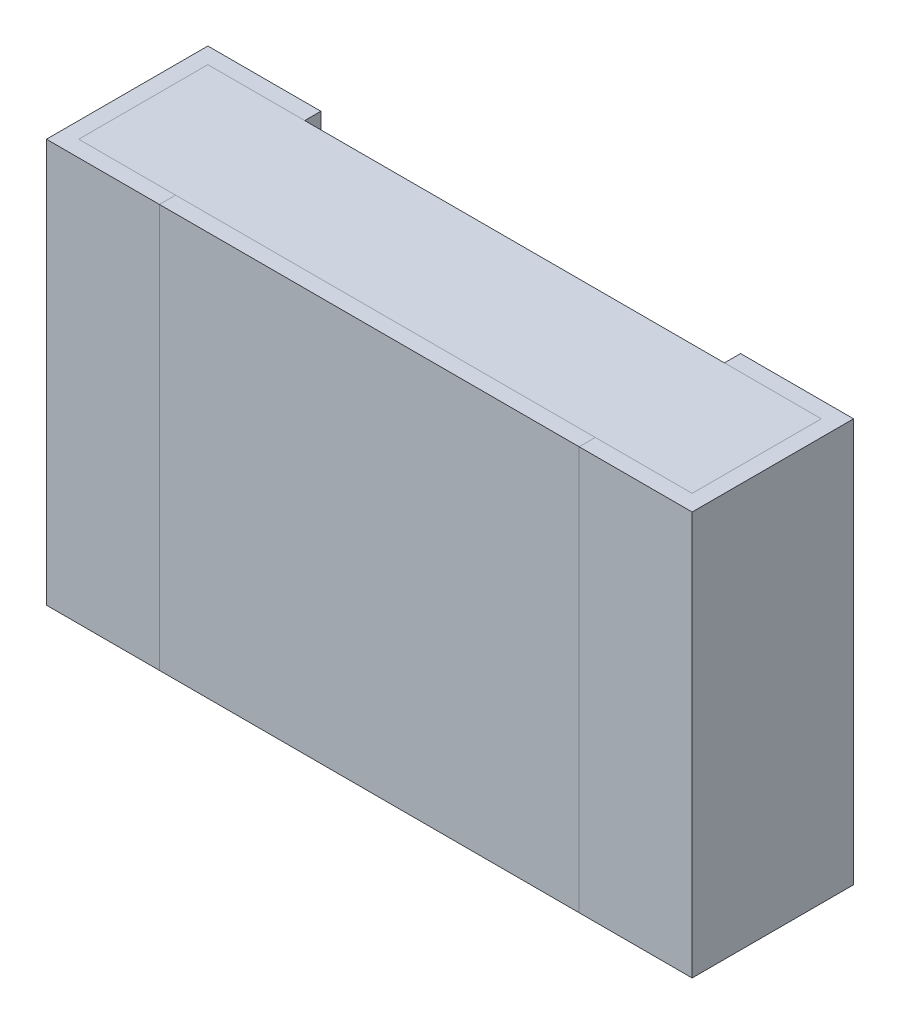
ISO-10303-21;
HEADER;
FILE_DESCRIPTION(('STEP AP214'),'2;1');
FILE_NAME('part.step','',(''),(''),'','','');
FILE_SCHEMA(('AUTOMOTIVE_DESIGN { 1 0 10303 214 1 1 1 1 }'));
ENDSEC;
DATA;
#1=APPLICATION_CONTEXT('core data for automotive mechanical design processes');
#2=APPLICATION_PROTOCOL_DEFINITION('international standard','automotive_design',2000,#1);
#3=PRODUCT_CONTEXT('',#1,'mechanical');
#4=PRODUCT('Part','Part','',(#3));
#5=PRODUCT_RELATED_PRODUCT_CATEGORY('part','',(#4));
#6=PRODUCT_DEFINITION_FORMATION('','',#4);
#7=PRODUCT_DEFINITION_CONTEXT('part definition',#1,'design');
#8=PRODUCT_DEFINITION('design','',#6,#7);
#9=PRODUCT_DEFINITION_SHAPE('','',#8);
#10=(LENGTH_UNIT() NAMED_UNIT(*) SI_UNIT(.MILLI.,.METRE.));
#11=(NAMED_UNIT(*) PLANE_ANGLE_UNIT() SI_UNIT($,.RADIAN.));
#12=(NAMED_UNIT(*) SI_UNIT($,.STERADIAN.) SOLID_ANGLE_UNIT());
#13=UNCERTAINTY_MEASURE_WITH_UNIT(LENGTH_MEASURE(1.E-05),#10,'distance_accuracy_value','');
#14=(GEOMETRIC_REPRESENTATION_CONTEXT(3) GLOBAL_UNCERTAINTY_ASSIGNED_CONTEXT((#13)) GLOBAL_UNIT_ASSIGNED_CONTEXT((#10,
#11,#12)) REPRESENTATION_CONTEXT('',''));
#15=CARTESIAN_POINT('',(0.,0.,0.));
#16=DIRECTION('',(0.,0.,1.));
#17=DIRECTION('',(1.,0.,0.));
#18=AXIS2_PLACEMENT_3D('',#15,#16,#17);
#19=CARTESIAN_POINT('',(-0.949999890721515,-0.625000166103266,0.05));
#20=DIRECTION('',(0.999999999999985,1.74845553146949E-07,0.));
#21=DIRECTION('',(0.,0.,1.));
#22=AXIS2_PLACEMENT_3D('',#19,#20,#21);
#23=PLANE('',#22);
#24=DIRECTION('',(-1.74845553146949E-07,0.999999999999985,0.));
#25=VECTOR('',#24,1.);
#26=CARTESIAN_POINT('',(-0.949999890721515,-0.625000166103266,0.45));
#27=LINE('',#26,#25);
#28=CARTESIAN_POINT('',(-0.949999890721515,-0.625000166103266,0.45));
#29=VERTEX_POINT('',#28);
#30=CARTESIAN_POINT('',(-0.950000109278456,0.624999833896715,0.45));
#31=VERTEX_POINT('',#30);
#32=EDGE_CURVE('P0_E11',#29,#31,#27,.T.);
#33=ORIENTED_EDGE('',*,*,#32,.T.);
#34=DIRECTION('',(0.,0.,1.));
#35=VECTOR('',#34,1.);
#36=CARTESIAN_POINT('',(-0.950000109278456,0.624999833896715,0.05));
#37=LINE('',#36,#35);
#38=CARTESIAN_POINT('',(-0.950000109278456,0.624999833896715,0.05));
#39=VERTEX_POINT('',#38);
#40=EDGE_CURVE('P0_E24',#39,#31,#37,.T.);
#41=ORIENTED_EDGE('',*,*,#40,.F.);
#42=DIRECTION('',(-1.74845553146949E-07,0.999999999999985,0.));
#43=VECTOR('',#42,1.);
#44=CARTESIAN_POINT('',(-0.949999890721515,-0.625000166103266,0.05));
#45=LINE('',#44,#43);
#46=CARTESIAN_POINT('',(-0.949999890721515,-0.625000166103266,0.05));
#47=VERTEX_POINT('',#46);
#48=EDGE_CURVE('P0_E88',#47,#39,#45,.T.);
#49=ORIENTED_EDGE('',*,*,#48,.F.);
#50=DIRECTION('',(0.,0.,1.));
#51=VECTOR('',#50,1.);
#52=CARTESIAN_POINT('',(-0.949999890721515,-0.625000166103266,0.05));
#53=LINE('',#52,#51);
#54=EDGE_CURVE('P0_E38',#47,#29,#53,.T.);
#55=ORIENTED_EDGE('',*,*,#54,.T.);
#56=EDGE_LOOP('',(#33,#41,#49,#55));
#57=FACE_BOUND('',#56,.T.);
#58=ADVANCED_FACE('P0_F17',(#57),#23,.F.);
#59=CARTESIAN_POINT('',(0.950000109278456,-0.624999833896715,0.05));
#60=DIRECTION('',(0.999999999999985,1.74845553146949E-07,0.));
#61=DIRECTION('',(0.,0.,1.));
#62=AXIS2_PLACEMENT_3D('',#59,#60,#61);
#63=PLANE('',#62);
#64=DIRECTION('',(0.,0.,1.));
#65=VECTOR('',#64,1.);
#66=CARTESIAN_POINT('',(0.950000109278456,-0.624999833896715,0.05));
#67=LINE('',#66,#65);
#68=CARTESIAN_POINT('',(0.950000109278456,-0.624999833896715,0.05));
#69=VERTEX_POINT('',#68);
#70=CARTESIAN_POINT('',(0.950000109278456,-0.624999833896715,0.45));
#71=VERTEX_POINT('',#70);
#72=EDGE_CURVE('P0_E83',#69,#71,#67,.T.);
#73=ORIENTED_EDGE('',*,*,#72,.F.);
#74=DIRECTION('',(-1.74845553146949E-07,0.999999999999985,0.));
#75=VECTOR('',#74,1.);
#76=CARTESIAN_POINT('',(0.950000109278456,-0.624999833896715,0.05));
#77=LINE('',#76,#75);
#78=CARTESIAN_POINT('',(0.949999890721515,0.625000166103266,0.05));
#79=VERTEX_POINT('',#78);
#80=EDGE_CURVE('P0_E64',#69,#79,#77,.T.);
#81=ORIENTED_EDGE('',*,*,#80,.T.);
#82=DIRECTION('',(0.,0.,1.));
#83=VECTOR('',#82,1.);
#84=CARTESIAN_POINT('',(0.949999890721515,0.625000166103266,0.05));
#85=LINE('',#84,#83);
#86=CARTESIAN_POINT('',(0.949999890721515,0.625000166103266,0.45));
#87=VERTEX_POINT('',#86);
#88=EDGE_CURVE('P0_E60',#79,#87,#85,.T.);
#89=ORIENTED_EDGE('',*,*,#88,.T.);
#90=DIRECTION('',(-1.74845553146949E-07,0.999999999999985,0.));
#91=VECTOR('',#90,1.);
#92=CARTESIAN_POINT('',(0.950000109278456,-0.624999833896715,0.45));
#93=LINE('',#92,#91);
#94=EDGE_CURVE('P0_E58',#71,#87,#93,.T.);
#95=ORIENTED_EDGE('',*,*,#94,.F.);
#96=EDGE_LOOP('',(#73,#81,#89,#95));
#97=FACE_BOUND('',#96,.T.);
#98=ADVANCED_FACE('P0_F56',(#97),#63,.T.);
#99=CARTESIAN_POINT('',(-0.949999890721515,-0.625000166103266,0.05));
#100=DIRECTION('',(-1.74845553146949E-07,0.999999999999985,0.));
#101=DIRECTION('',(0.,0.,1.));
#102=AXIS2_PLACEMENT_3D('',#99,#100,#101);
#103=PLANE('',#102);
#104=ORIENTED_EDGE('',*,*,#72,.T.);
#105=DIRECTION('',(0.999999999999985,1.74845553146949E-07,0.));
#106=VECTOR('',#105,1.);
#107=CARTESIAN_POINT('',(-0.949999890721515,-0.625000166103266,0.45));
#108=LINE('',#107,#106);
#109=EDGE_CURVE('P0_E75',#29,#71,#108,.T.);
#110=ORIENTED_EDGE('',*,*,#109,.F.);
#111=ORIENTED_EDGE('',*,*,#54,.F.);
#112=DIRECTION('',(0.999999999999985,1.74845553146949E-07,0.));
#113=VECTOR('',#112,1.);
#114=CARTESIAN_POINT('',(-0.949999890721515,-0.625000166103266,0.05));
#115=LINE('',#114,#113);
#116=EDGE_CURVE('P0_E76',#47,#69,#115,.T.);
#117=ORIENTED_EDGE('',*,*,#116,.T.);
#118=EDGE_LOOP('',(#104,#110,#111,#117));
#119=FACE_BOUND('',#118,.T.);
#120=ADVANCED_FACE('P0_F93',(#119),#103,.F.);
#121=CARTESIAN_POINT('',(-0.950000109278456,0.624999833896715,0.05));
#122=DIRECTION('',(-1.74845553146949E-07,0.999999999999985,0.));
#123=DIRECTION('',(0.,0.,1.));
#124=AXIS2_PLACEMENT_3D('',#121,#122,#123);
#125=PLANE('',#124);
#126=DIRECTION('',(0.999999999999985,1.74845553146949E-07,0.));
#127=VECTOR('',#126,1.);
#128=CARTESIAN_POINT('',(-0.950000109278456,0.624999833896715,0.05));
#129=LINE('',#128,#127);
#130=EDGE_CURVE('P0_E72',#39,#79,#129,.T.);
#131=ORIENTED_EDGE('',*,*,#130,.F.);
#132=ORIENTED_EDGE('',*,*,#40,.T.);
#133=DIRECTION('',(0.999999999999985,1.74845553146949E-07,0.));
#134=VECTOR('',#133,1.);
#135=CARTESIAN_POINT('',(-0.950000109278456,0.624999833896715,0.45));
#136=LINE('',#135,#134);
#137=EDGE_CURVE('P0_E67',#31,#87,#136,.T.);
#138=ORIENTED_EDGE('',*,*,#137,.T.);
#139=ORIENTED_EDGE('',*,*,#88,.F.);
#140=EDGE_LOOP('',(#131,#132,#138,#139));
#141=FACE_BOUND('',#140,.T.);
#142=ADVANCED_FACE('P0_F73',(#141),#125,.T.);
#143=CARTESIAN_POINT('',(-0.949999890721515,-0.625000166103266,0.05));
#144=DIRECTION('',(0.,0.,1.));
#145=DIRECTION('',(0.999999999999985,1.74845553146949E-07,0.));
#146=AXIS2_PLACEMENT_3D('',#143,#144,#145);
#147=PLANE('',#146);
#148=ORIENTED_EDGE('',*,*,#130,.T.);
#149=ORIENTED_EDGE('',*,*,#80,.F.);
#150=ORIENTED_EDGE('',*,*,#116,.F.);
#151=ORIENTED_EDGE('',*,*,#48,.T.);
#152=EDGE_LOOP('',(#148,#149,#150,#151));
#153=FACE_BOUND('',#152,.T.);
#154=ADVANCED_FACE('P0_F90',(#153),#147,.F.);
#155=CARTESIAN_POINT('',(-0.949999890721515,-0.625000166103266,0.45));
#156=DIRECTION('',(0.,0.,1.));
#157=DIRECTION('',(0.999999999999985,1.74845553146949E-07,0.));
#158=AXIS2_PLACEMENT_3D('',#155,#156,#157);
#159=PLANE('',#158);
#160=ORIENTED_EDGE('',*,*,#32,.F.);
#161=ORIENTED_EDGE('',*,*,#109,.T.);
#162=ORIENTED_EDGE('',*,*,#94,.T.);
#163=ORIENTED_EDGE('',*,*,#137,.F.);
#164=EDGE_LOOP('',(#160,#161,#162,#163));
#165=FACE_BOUND('',#164,.T.);
#166=ADVANCED_FACE('P0_F68',(#165),#159,.T.);
#167=CLOSED_SHELL('',(#58,#98,#120,#142,#154,#166));
#168=MANIFOLD_SOLID_BREP('P0_B1',#167);
#169=CARTESIAN_POINT('',(-0.999999890721514,-0.625000174845544,0.));
#170=DIRECTION('',(0.999999999999985,1.74845553146949E-07,0.));
#171=DIRECTION('',(0.,0.,1.));
#172=AXIS2_PLACEMENT_3D('',#169,#170,#171);
#173=PLANE('',#172);
#174=DIRECTION('',(-1.74845553146949E-07,0.999999999999985,0.));
#175=VECTOR('',#174,1.);
#176=CARTESIAN_POINT('',(-0.999999890721514,-0.625000174845544,0.5));
#177=LINE('',#176,#175);
#178=CARTESIAN_POINT('',(-0.999999890721514,-0.625000174845544,0.5));
#179=VERTEX_POINT('',#178);
#180=CARTESIAN_POINT('',(-1.00000010927845,0.624999825154437,0.5));
#181=VERTEX_POINT('',#180);
#182=EDGE_CURVE('P1_E11',#179,#181,#177,.T.);
#183=ORIENTED_EDGE('',*,*,#182,.T.);
#184=DIRECTION('',(0.,0.,1.));
#185=VECTOR('',#184,1.);
#186=CARTESIAN_POINT('',(-1.00000010927845,0.624999825154437,0.));
#187=LINE('',#186,#185);
#188=CARTESIAN_POINT('',(-1.00000010927845,0.624999825154437,0.));
#189=VERTEX_POINT('',#188);
#190=EDGE_CURVE('P1_E24',#189,#181,#187,.T.);
#191=ORIENTED_EDGE('',*,*,#190,.F.);
#192=DIRECTION('',(-1.74845553146949E-07,0.999999999999985,0.));
#193=VECTOR('',#192,1.);
#194=CARTESIAN_POINT('',(-0.999999890721514,-0.625000174845544,0.));
#195=LINE('',#194,#193);
#196=CARTESIAN_POINT('',(-0.999999890721514,-0.625000174845544,0.));
#197=VERTEX_POINT('',#196);
#198=EDGE_CURVE('P1_E141',#197,#189,#195,.T.);
#199=ORIENTED_EDGE('',*,*,#198,.F.);
#200=DIRECTION('',(0.,0.,1.));
#201=VECTOR('',#200,1.);
#202=CARTESIAN_POINT('',(-0.999999890721514,-0.625000174845544,0.));
#203=LINE('',#202,#201);
#204=EDGE_CURVE('P1_E38',#197,#179,#203,.T.);
#205=ORIENTED_EDGE('',*,*,#204,.T.);
#206=EDGE_LOOP('',(#183,#191,#199,#205));
#207=FACE_BOUND('',#206,.T.);
#208=ADVANCED_FACE('P1_F17',(#207),#173,.F.);
#209=CARTESIAN_POINT('',(-0.999999890721514,-0.625000174845544,0.));
#210=DIRECTION('',(-1.74845553146949E-07,0.999999999999985,0.));
#211=DIRECTION('',(0.,0.,1.));
#212=AXIS2_PLACEMENT_3D('',#209,#210,#211);
#213=PLANE('',#212);
#214=DIRECTION('',(0.999999999999985,1.74845553146949E-07,0.));
#215=VECTOR('',#214,1.);
#216=CARTESIAN_POINT('',(-0.949999890721515,-0.625000166103266,0.05));
#217=LINE('',#216,#215);
#218=CARTESIAN_POINT('',(-0.949999890721515,-0.625000166103266,0.05));
#219=VERTEX_POINT('',#218);
#220=CARTESIAN_POINT('',(-0.649999890721519,-0.6250001136496,0.05));
#221=VERTEX_POINT('',#220);
#222=EDGE_CURVE('P1_E139',#219,#221,#217,.T.);
#223=ORIENTED_EDGE('',*,*,#222,.F.);
#224=DIRECTION('',(0.,0.,1.));
#225=VECTOR('',#224,1.);
#226=CARTESIAN_POINT('',(-0.949999890721515,-0.625000166103266,0.05));
#227=LINE('',#226,#225);
#228=CARTESIAN_POINT('',(-0.949999890721515,-0.625000166103266,0.45));
#229=VERTEX_POINT('',#228);
#230=EDGE_CURVE('P1_E101',#219,#229,#227,.T.);
#231=ORIENTED_EDGE('',*,*,#230,.T.);
#232=DIRECTION('',(0.999999999999985,1.74845553146949E-07,0.));
#233=VECTOR('',#232,1.);
#234=CARTESIAN_POINT('',(-0.949999890721515,-0.625000166103266,0.45));
#235=LINE('',#234,#233);
#236=CARTESIAN_POINT('',(-0.649999890721519,-0.6250001136496,0.45));
#237=VERTEX_POINT('',#236);
#238=EDGE_CURVE('P1_E136',#229,#237,#235,.T.);
#239=ORIENTED_EDGE('',*,*,#238,.T.);
#240=DIRECTION('',(0.,0.,1.));
#241=VECTOR('',#240,1.);
#242=CARTESIAN_POINT('',(-0.649999890721519,-0.6250001136496,0.));
#243=LINE('',#242,#241);
#244=CARTESIAN_POINT('',(-0.649999890721519,-0.6250001136496,0.5));
#245=VERTEX_POINT('',#244);
#246=EDGE_CURVE('P1_E132',#237,#245,#243,.T.);
#247=ORIENTED_EDGE('',*,*,#246,.T.);
#248=DIRECTION('',(0.999999999999985,1.74845553146949E-07,0.));
#249=VECTOR('',#248,1.);
#250=CARTESIAN_POINT('',(-0.999999890721514,-0.625000174845544,0.5));
#251=LINE('',#250,#249);
#252=EDGE_CURVE('P1_E131',#179,#245,#251,.T.);
#253=ORIENTED_EDGE('',*,*,#252,.F.);
#254=ORIENTED_EDGE('',*,*,#204,.F.);
#255=DIRECTION('',(0.999999999999985,1.74845553146949E-07,0.));
#256=VECTOR('',#255,1.);
#257=CARTESIAN_POINT('',(-0.999999890721514,-0.625000174845544,0.));
#258=LINE('',#257,#256);
#259=CARTESIAN_POINT('',(-0.649999890721519,-0.6250001136496,0.));
#260=VERTEX_POINT('',#259);
#261=EDGE_CURVE('P1_E128',#197,#260,#258,.T.);
#262=ORIENTED_EDGE('',*,*,#261,.T.);
#263=DIRECTION('',(0.,0.,1.));
#264=VECTOR('',#263,1.);
#265=CARTESIAN_POINT('',(-0.649999890721519,-0.6250001136496,0.));
#266=LINE('',#265,#264);
#267=EDGE_CURVE('P1_E130',#260,#221,#266,.T.);
#268=ORIENTED_EDGE('',*,*,#267,.T.);
#269=EDGE_LOOP('',(#223,#231,#239,#247,#253,#254,#262,#268));
#270=FACE_BOUND('',#269,.T.);
#271=ADVANCED_FACE('P1_F155',(#270),#213,.F.);
#272=CARTESIAN_POINT('',(-0.999999890721514,-0.625000174845544,0.5));
#273=DIRECTION('',(0.,0.,1.));
#274=DIRECTION('',(0.999999999999985,1.74845553146949E-07,0.));
#275=AXIS2_PLACEMENT_3D('',#272,#273,#274);
#276=PLANE('',#275);
#277=ORIENTED_EDGE('',*,*,#182,.F.);
#278=ORIENTED_EDGE('',*,*,#252,.T.);
#279=DIRECTION('',(-1.74845553146949E-07,0.999999999999985,0.));
#280=VECTOR('',#279,1.);
#281=CARTESIAN_POINT('',(-0.649999890721519,-0.6250001136496,0.5));
#282=LINE('',#281,#280);
#283=CARTESIAN_POINT('',(-0.650000109278461,0.624999886350381,0.5));
#284=VERTEX_POINT('',#283);
#285=EDGE_CURVE('P1_E123',#245,#284,#282,.T.);
#286=ORIENTED_EDGE('',*,*,#285,.T.);
#287=DIRECTION('',(0.999999999999985,1.74845553146949E-07,0.));
#288=VECTOR('',#287,1.);
#289=CARTESIAN_POINT('',(-1.00000010927845,0.624999825154437,0.5));
#290=LINE('',#289,#288);
#291=EDGE_CURVE('P1_E121',#181,#284,#290,.T.);
#292=ORIENTED_EDGE('',*,*,#291,.F.);
#293=EDGE_LOOP('',(#277,#278,#286,#292));
#294=FACE_BOUND('',#293,.T.);
#295=ADVANCED_FACE('P1_F156',(#294),#276,.T.);
#296=CARTESIAN_POINT('',(-1.00000010927845,0.624999825154437,0.));
#297=DIRECTION('',(-1.74845553146949E-07,0.999999999999985,0.));
#298=DIRECTION('',(0.,0.,1.));
#299=AXIS2_PLACEMENT_3D('',#296,#297,#298);
#300=PLANE('',#299);
#301=DIRECTION('',(0.,0.,1.));
#302=VECTOR('',#301,1.);
#303=CARTESIAN_POINT('',(-0.650000109278461,0.624999886350381,0.));
#304=LINE('',#303,#302);
#305=CARTESIAN_POINT('',(-0.650000109278461,0.624999886350381,0.));
#306=VERTEX_POINT('',#305);
#307=CARTESIAN_POINT('',(-0.650000109278461,0.624999886350381,0.05));
#308=VERTEX_POINT('',#307);
#309=EDGE_CURVE('P1_E118',#306,#308,#304,.T.);
#310=ORIENTED_EDGE('',*,*,#309,.F.);
#311=DIRECTION('',(0.999999999999985,1.74845553146949E-07,0.));
#312=VECTOR('',#311,1.);
#313=CARTESIAN_POINT('',(-1.00000010927845,0.624999825154437,0.));
#314=LINE('',#313,#312);
#315=EDGE_CURVE('P1_E116',#189,#306,#314,.T.);
#316=ORIENTED_EDGE('',*,*,#315,.F.);
#317=ORIENTED_EDGE('',*,*,#190,.T.);
#318=ORIENTED_EDGE('',*,*,#291,.T.);
#319=DIRECTION('',(0.,0.,1.));
#320=VECTOR('',#319,1.);
#321=CARTESIAN_POINT('',(-0.650000109278461,0.624999886350381,0.));
#322=LINE('',#321,#320);
#323=CARTESIAN_POINT('',(-0.650000109278461,0.624999886350381,0.45));
#324=VERTEX_POINT('',#323);
#325=EDGE_CURVE('P1_E114',#324,#284,#322,.T.);
#326=ORIENTED_EDGE('',*,*,#325,.F.);
#327=DIRECTION('',(0.999999999999985,1.74845553146949E-07,0.));
#328=VECTOR('',#327,1.);
#329=CARTESIAN_POINT('',(-0.950000109278456,0.624999833896715,0.45));
#330=LINE('',#329,#328);
#331=CARTESIAN_POINT('',(-0.950000109278456,0.624999833896715,0.45));
#332=VERTEX_POINT('',#331);
#333=EDGE_CURVE('P1_E84',#332,#324,#330,.T.);
#334=ORIENTED_EDGE('',*,*,#333,.F.);
#335=DIRECTION('',(0.,0.,1.));
#336=VECTOR('',#335,1.);
#337=CARTESIAN_POINT('',(-0.950000109278456,0.624999833896715,0.05));
#338=LINE('',#337,#336);
#339=CARTESIAN_POINT('',(-0.950000109278456,0.624999833896715,0.05));
#340=VERTEX_POINT('',#339);
#341=EDGE_CURVE('P1_E78',#340,#332,#338,.T.);
#342=ORIENTED_EDGE('',*,*,#341,.F.);
#343=DIRECTION('',(0.999999999999985,1.74845553146949E-07,0.));
#344=VECTOR('',#343,1.);
#345=CARTESIAN_POINT('',(-0.950000109278456,0.624999833896715,0.05));
#346=LINE('',#345,#344);
#347=EDGE_CURVE('P1_E85',#340,#308,#346,.T.);
#348=ORIENTED_EDGE('',*,*,#347,.T.);
#349=EDGE_LOOP('',(#310,#316,#317,#318,#326,#334,#342,#348));
#350=FACE_BOUND('',#349,.T.);
#351=ADVANCED_FACE('P1_F81',(#350),#300,.T.);
#352=CARTESIAN_POINT('',(-0.999999890721514,-0.625000174845544,0.));
#353=DIRECTION('',(0.,0.,1.));
#354=DIRECTION('',(0.999999999999985,1.74845553146949E-07,0.));
#355=AXIS2_PLACEMENT_3D('',#352,#353,#354);
#356=PLANE('',#355);
#357=ORIENTED_EDGE('',*,*,#315,.T.);
#358=DIRECTION('',(-1.74845553146949E-07,0.999999999999985,0.));
#359=VECTOR('',#358,1.);
#360=CARTESIAN_POINT('',(-0.649999890721519,-0.6250001136496,0.));
#361=LINE('',#360,#359);
#362=EDGE_CURVE('P1_E98',#260,#306,#361,.T.);
#363=ORIENTED_EDGE('',*,*,#362,.F.);
#364=ORIENTED_EDGE('',*,*,#261,.F.);
#365=ORIENTED_EDGE('',*,*,#198,.T.);
#366=EDGE_LOOP('',(#357,#363,#364,#365));
#367=FACE_BOUND('',#366,.T.);
#368=ADVANCED_FACE('P1_F148',(#367),#356,.F.);
#369=CARTESIAN_POINT('',(-0.649999890721519,-0.6250001136496,0.));
#370=DIRECTION('',(0.999999999999985,1.74845553146949E-07,0.));
#371=DIRECTION('',(0.,0.,1.));
#372=AXIS2_PLACEMENT_3D('',#369,#370,#371);
#373=PLANE('',#372);
#374=ORIENTED_EDGE('',*,*,#267,.F.);
#375=ORIENTED_EDGE('',*,*,#362,.T.);
#376=ORIENTED_EDGE('',*,*,#309,.T.);
#377=DIRECTION('',(1.74845553146949E-07,-0.999999999999985,0.));
#378=VECTOR('',#377,1.);
#379=CARTESIAN_POINT('',(-0.649999890721519,-0.6250001136496,0.05));
#380=LINE('',#379,#378);
#381=EDGE_CURVE('P1_E100',#308,#221,#380,.T.);
#382=ORIENTED_EDGE('',*,*,#381,.T.);
#383=EDGE_LOOP('',(#374,#375,#376,#382));
#384=FACE_BOUND('',#383,.T.);
#385=ADVANCED_FACE('P1_F147',(#384),#373,.T.);
#386=CARTESIAN_POINT('',(-0.949999890721515,-0.625000166103266,0.05));
#387=DIRECTION('',(0.,0.,1.));
#388=DIRECTION('',(0.999999999999985,1.74845553146949E-07,0.));
#389=AXIS2_PLACEMENT_3D('',#386,#387,#388);
#390=PLANE('',#389);
#391=ORIENTED_EDGE('',*,*,#347,.F.);
#392=DIRECTION('',(-1.74845553146949E-07,0.999999999999985,0.));
#393=VECTOR('',#392,1.);
#394=CARTESIAN_POINT('',(-0.949999890721515,-0.625000166103266,0.05));
#395=LINE('',#394,#393);
#396=EDGE_CURVE('P1_E92',#219,#340,#395,.T.);
#397=ORIENTED_EDGE('',*,*,#396,.F.);
#398=ORIENTED_EDGE('',*,*,#222,.T.);
#399=ORIENTED_EDGE('',*,*,#381,.F.);
#400=EDGE_LOOP('',(#391,#397,#398,#399));
#401=FACE_BOUND('',#400,.T.);
#402=ADVANCED_FACE('P1_F91',(#401),#390,.T.);
#403=CARTESIAN_POINT('',(-0.949999890721515,-0.625000166103266,0.05));
#404=DIRECTION('',(0.999999999999985,1.74845553146949E-07,0.));
#405=DIRECTION('',(0.,0.,1.));
#406=AXIS2_PLACEMENT_3D('',#403,#404,#405);
#407=PLANE('',#406);
#408=ORIENTED_EDGE('',*,*,#230,.F.);
#409=ORIENTED_EDGE('',*,*,#396,.T.);
#410=ORIENTED_EDGE('',*,*,#341,.T.);
#411=DIRECTION('',(-1.74845553146949E-07,0.999999999999985,0.));
#412=VECTOR('',#411,1.);
#413=CARTESIAN_POINT('',(-0.949999890721515,-0.625000166103266,0.45));
#414=LINE('',#413,#412);
#415=EDGE_CURVE('P1_E103',#229,#332,#414,.T.);
#416=ORIENTED_EDGE('',*,*,#415,.F.);
#417=EDGE_LOOP('',(#408,#409,#410,#416));
#418=FACE_BOUND('',#417,.T.);
#419=ADVANCED_FACE('P1_F99',(#418),#407,.T.);
#420=CARTESIAN_POINT('',(-0.949999890721515,-0.625000166103266,0.45));
#421=DIRECTION('',(0.,0.,1.));
#422=DIRECTION('',(0.999999999999985,1.74845553146949E-07,0.));
#423=AXIS2_PLACEMENT_3D('',#420,#421,#422);
#424=PLANE('',#423);
#425=DIRECTION('',(1.74845553146949E-07,-0.999999999999985,0.));
#426=VECTOR('',#425,1.);
#427=CARTESIAN_POINT('',(-0.649999890721519,-0.6250001136496,0.45));
#428=LINE('',#427,#426);
#429=EDGE_CURVE('P1_E106',#324,#237,#428,.T.);
#430=ORIENTED_EDGE('',*,*,#429,.T.);
#431=ORIENTED_EDGE('',*,*,#238,.F.);
#432=ORIENTED_EDGE('',*,*,#415,.T.);
#433=ORIENTED_EDGE('',*,*,#333,.T.);
#434=EDGE_LOOP('',(#430,#431,#432,#433));
#435=FACE_BOUND('',#434,.T.);
#436=ADVANCED_FACE('P1_F161',(#435),#424,.F.);
#437=CARTESIAN_POINT('',(-0.649999890721519,-0.6250001136496,0.));
#438=DIRECTION('',(0.999999999999985,1.74845553146949E-07,0.));
#439=DIRECTION('',(0.,0.,1.));
#440=AXIS2_PLACEMENT_3D('',#437,#438,#439);
#441=PLANE('',#440);
#442=ORIENTED_EDGE('',*,*,#246,.F.);
#443=ORIENTED_EDGE('',*,*,#429,.F.);
#444=ORIENTED_EDGE('',*,*,#325,.T.);
#445=ORIENTED_EDGE('',*,*,#285,.F.);
#446=EDGE_LOOP('',(#442,#443,#444,#445));
#447=FACE_BOUND('',#446,.T.);
#448=ADVANCED_FACE('P1_F162',(#447),#441,.T.);
#449=CLOSED_SHELL('',(#208,#271,#295,#351,#368,#385,#402,#419,#436,#448));
#450=MANIFOLD_SOLID_BREP('P1_B1',#449);
#451=CARTESIAN_POINT('',(0.999999890721514,0.625000174845544,0.));
#452=DIRECTION('',(-0.999999999999985,-1.74845553024484E-07,0.));
#453=DIRECTION('',(0.,0.,1.));
#454=AXIS2_PLACEMENT_3D('',#451,#452,#453);
#455=PLANE('',#454);
#456=DIRECTION('',(1.74845553024484E-07,-0.999999999999985,0.));
#457=VECTOR('',#456,1.);
#458=CARTESIAN_POINT('',(0.999999890721514,0.625000174845544,0.5));
#459=LINE('',#458,#457);
#460=CARTESIAN_POINT('',(0.999999890721514,0.625000174845544,0.5));
#461=VERTEX_POINT('',#460);
#462=CARTESIAN_POINT('',(1.00000010927845,-0.624999825154437,0.5));
#463=VERTEX_POINT('',#462);
#464=EDGE_CURVE('P2_E11',#461,#463,#459,.T.);
#465=ORIENTED_EDGE('',*,*,#464,.T.);
#466=DIRECTION('',(0.,0.,1.));
#467=VECTOR('',#466,1.);
#468=CARTESIAN_POINT('',(1.00000010927845,-0.624999825154437,0.));
#469=LINE('',#468,#467);
#470=CARTESIAN_POINT('',(1.00000010927845,-0.624999825154437,0.));
#471=VERTEX_POINT('',#470);
#472=EDGE_CURVE('P2_E24',#471,#463,#469,.T.);
#473=ORIENTED_EDGE('',*,*,#472,.F.);
#474=DIRECTION('',(1.74845553024484E-07,-0.999999999999985,0.));
#475=VECTOR('',#474,1.);
#476=CARTESIAN_POINT('',(0.999999890721514,0.625000174845544,0.));
#477=LINE('',#476,#475);
#478=CARTESIAN_POINT('',(0.999999890721514,0.625000174845544,0.));
#479=VERTEX_POINT('',#478);
#480=EDGE_CURVE('P2_E143',#479,#471,#477,.T.);
#481=ORIENTED_EDGE('',*,*,#480,.F.);
#482=DIRECTION('',(0.,0.,1.));
#483=VECTOR('',#482,1.);
#484=CARTESIAN_POINT('',(0.999999890721514,0.625000174845544,0.));
#485=LINE('',#484,#483);
#486=EDGE_CURVE('P2_E36',#479,#461,#485,.T.);
#487=ORIENTED_EDGE('',*,*,#486,.T.);
#488=EDGE_LOOP('',(#465,#473,#481,#487));
#489=FACE_BOUND('',#488,.T.);
#490=ADVANCED_FACE('P2_F17',(#489),#455,.F.);
#491=CARTESIAN_POINT('',(0.999999890721514,0.625000174845544,0.));
#492=DIRECTION('',(1.74845553024484E-07,-0.999999999999985,0.));
#493=DIRECTION('',(0.,0.,1.));
#494=AXIS2_PLACEMENT_3D('',#491,#492,#493);
#495=PLANE('',#494);
#496=DIRECTION('',(-0.999999999999985,-1.74845553024484E-07,0.));
#497=VECTOR('',#496,1.);
#498=CARTESIAN_POINT('',(0.949999890721515,0.625000166103266,0.05));
#499=LINE('',#498,#497);
#500=CARTESIAN_POINT('',(0.949999890721515,0.625000166103266,0.05));
#501=VERTEX_POINT('',#500);
#502=CARTESIAN_POINT('',(0.649999890721519,0.6250001136496,0.05));
#503=VERTEX_POINT('',#502);
#504=EDGE_CURVE('P2_E138',#501,#503,#499,.T.);
#505=ORIENTED_EDGE('',*,*,#504,.F.);
#506=DIRECTION('',(0.,0.,1.));
#507=VECTOR('',#506,1.);
#508=CARTESIAN_POINT('',(0.949999890721515,0.625000166103266,0.05));
#509=LINE('',#508,#507);
#510=CARTESIAN_POINT('',(0.949999890721515,0.625000166103266,0.45));
#511=VERTEX_POINT('',#510);
#512=EDGE_CURVE('P2_E100',#501,#511,#509,.T.);
#513=ORIENTED_EDGE('',*,*,#512,.T.);
#514=DIRECTION('',(-0.999999999999985,-1.74845553024484E-07,0.));
#515=VECTOR('',#514,1.);
#516=CARTESIAN_POINT('',(0.949999890721515,0.625000166103266,0.45));
#517=LINE('',#516,#515);
#518=CARTESIAN_POINT('',(0.649999890721519,0.6250001136496,0.45));
#519=VERTEX_POINT('',#518);
#520=EDGE_CURVE('P2_E133',#511,#519,#517,.T.);
#521=ORIENTED_EDGE('',*,*,#520,.T.);
#522=DIRECTION('',(0.,0.,1.));
#523=VECTOR('',#522,1.);
#524=CARTESIAN_POINT('',(0.649999890721519,0.6250001136496,0.));
#525=LINE('',#524,#523);
#526=CARTESIAN_POINT('',(0.649999890721519,0.6250001136496,0.5));
#527=VERTEX_POINT('',#526);
#528=EDGE_CURVE('P2_E131',#519,#527,#525,.T.);
#529=ORIENTED_EDGE('',*,*,#528,.T.);
#530=DIRECTION('',(-0.999999999999985,-1.74845553024484E-07,0.));
#531=VECTOR('',#530,1.);
#532=CARTESIAN_POINT('',(0.999999890721514,0.625000174845544,0.5));
#533=LINE('',#532,#531);
#534=EDGE_CURVE('P2_E127',#461,#527,#533,.T.);
#535=ORIENTED_EDGE('',*,*,#534,.F.);
#536=ORIENTED_EDGE('',*,*,#486,.F.);
#537=DIRECTION('',(-0.999999999999985,-1.74845553024484E-07,0.));
#538=VECTOR('',#537,1.);
#539=CARTESIAN_POINT('',(0.999999890721514,0.625000174845544,0.));
#540=LINE('',#539,#538);
#541=CARTESIAN_POINT('',(0.649999890721519,0.6250001136496,0.));
#542=VERTEX_POINT('',#541);
#543=EDGE_CURVE('P2_E130',#479,#542,#540,.T.);
#544=ORIENTED_EDGE('',*,*,#543,.T.);
#545=DIRECTION('',(0.,0.,1.));
#546=VECTOR('',#545,1.);
#547=CARTESIAN_POINT('',(0.649999890721519,0.6250001136496,0.));
#548=LINE('',#547,#546);
#549=EDGE_CURVE('P2_E122',#542,#503,#548,.T.);
#550=ORIENTED_EDGE('',*,*,#549,.T.);
#551=EDGE_LOOP('',(#505,#513,#521,#529,#535,#536,#544,#550));
#552=FACE_BOUND('',#551,.T.);
#553=ADVANCED_FACE('P2_F147',(#552),#495,.F.);
#554=CARTESIAN_POINT('',(0.999999890721514,0.625000174845544,0.5));
#555=DIRECTION('',(0.,0.,1.));
#556=DIRECTION('',(-0.999999999999985,-1.74845553024484E-07,0.));
#557=AXIS2_PLACEMENT_3D('',#554,#555,#556);
#558=PLANE('',#557);
#559=ORIENTED_EDGE('',*,*,#464,.F.);
#560=ORIENTED_EDGE('',*,*,#534,.T.);
#561=DIRECTION('',(1.74845553024484E-07,-0.999999999999985,0.));
#562=VECTOR('',#561,1.);
#563=CARTESIAN_POINT('',(0.649999890721519,0.6250001136496,0.5));
#564=LINE('',#563,#562);
#565=CARTESIAN_POINT('',(0.650000109278461,-0.624999886350381,0.5));
#566=VERTEX_POINT('',#565);
#567=EDGE_CURVE('P2_E125',#527,#566,#564,.T.);
#568=ORIENTED_EDGE('',*,*,#567,.T.);
#569=DIRECTION('',(-0.999999999999985,-1.74845553024484E-07,0.));
#570=VECTOR('',#569,1.);
#571=CARTESIAN_POINT('',(1.00000010927845,-0.624999825154437,0.5));
#572=LINE('',#571,#570);
#573=EDGE_CURVE('P2_E33',#463,#566,#572,.T.);
#574=ORIENTED_EDGE('',*,*,#573,.F.);
#575=EDGE_LOOP('',(#559,#560,#568,#574));
#576=FACE_BOUND('',#575,.T.);
#577=ADVANCED_FACE('P2_F145',(#576),#558,.T.);
#578=CARTESIAN_POINT('',(1.00000010927845,-0.624999825154437,0.));
#579=DIRECTION('',(1.74845553024484E-07,-0.999999999999985,0.));
#580=DIRECTION('',(0.,0.,1.));
#581=AXIS2_PLACEMENT_3D('',#578,#579,#580);
#582=PLANE('',#581);
#583=DIRECTION('',(0.,0.,1.));
#584=VECTOR('',#583,1.);
#585=CARTESIAN_POINT('',(0.650000109278461,-0.624999886350381,0.));
#586=LINE('',#585,#584);
#587=CARTESIAN_POINT('',(0.650000109278461,-0.624999886350381,0.));
#588=VERTEX_POINT('',#587);
#589=CARTESIAN_POINT('',(0.650000109278461,-0.624999886350381,0.05));
#590=VERTEX_POINT('',#589);
#591=EDGE_CURVE('P2_E118',#588,#590,#586,.T.);
#592=ORIENTED_EDGE('',*,*,#591,.F.);
#593=DIRECTION('',(-0.999999999999985,-1.74845553024484E-07,0.));
#594=VECTOR('',#593,1.);
#595=CARTESIAN_POINT('',(1.00000010927845,-0.624999825154437,0.));
#596=LINE('',#595,#594);
#597=EDGE_CURVE('P2_E116',#471,#588,#596,.T.);
#598=ORIENTED_EDGE('',*,*,#597,.F.);
#599=ORIENTED_EDGE('',*,*,#472,.T.);
#600=ORIENTED_EDGE('',*,*,#573,.T.);
#601=DIRECTION('',(0.,0.,1.));
#602=VECTOR('',#601,1.);
#603=CARTESIAN_POINT('',(0.650000109278461,-0.624999886350381,0.));
#604=LINE('',#603,#602);
#605=CARTESIAN_POINT('',(0.650000109278461,-0.624999886350381,0.45));
#606=VERTEX_POINT('',#605);
#607=EDGE_CURVE('P2_E114',#606,#566,#604,.T.);
#608=ORIENTED_EDGE('',*,*,#607,.F.);
#609=DIRECTION('',(-0.999999999999985,-1.74845553024484E-07,0.));
#610=VECTOR('',#609,1.);
#611=CARTESIAN_POINT('',(0.950000109278456,-0.624999833896715,0.45));
#612=LINE('',#611,#610);
#613=CARTESIAN_POINT('',(0.950000109278456,-0.624999833896715,0.45));
#614=VERTEX_POINT('',#613);
#615=EDGE_CURVE('P2_E90',#614,#606,#612,.T.);
#616=ORIENTED_EDGE('',*,*,#615,.F.);
#617=DIRECTION('',(0.,0.,1.));
#618=VECTOR('',#617,1.);
#619=CARTESIAN_POINT('',(0.950000109278456,-0.624999833896715,0.05));
#620=LINE('',#619,#618);
#621=CARTESIAN_POINT('',(0.950000109278456,-0.624999833896715,0.05));
#622=VERTEX_POINT('',#621);
#623=EDGE_CURVE('P2_E85',#622,#614,#620,.T.);
#624=ORIENTED_EDGE('',*,*,#623,.F.);
#625=DIRECTION('',(-0.999999999999985,-1.74845553024484E-07,0.));
#626=VECTOR('',#625,1.);
#627=CARTESIAN_POINT('',(0.950000109278456,-0.624999833896715,0.05));
#628=LINE('',#627,#626);
#629=EDGE_CURVE('P2_E88',#622,#590,#628,.T.);
#630=ORIENTED_EDGE('',*,*,#629,.T.);
#631=EDGE_LOOP('',(#592,#598,#599,#600,#608,#616,#624,#630));
#632=FACE_BOUND('',#631,.T.);
#633=ADVANCED_FACE('P2_F82',(#632),#582,.T.);
#634=CARTESIAN_POINT('',(0.999999890721514,0.625000174845544,0.));
#635=DIRECTION('',(0.,0.,1.));
#636=DIRECTION('',(-0.999999999999985,-1.74845553024484E-07,0.));
#637=AXIS2_PLACEMENT_3D('',#634,#635,#636);
#638=PLANE('',#637);
#639=ORIENTED_EDGE('',*,*,#597,.T.);
#640=DIRECTION('',(1.74845553024484E-07,-0.999999999999985,0.));
#641=VECTOR('',#640,1.);
#642=CARTESIAN_POINT('',(0.649999890721519,0.6250001136496,0.));
#643=LINE('',#642,#641);
#644=EDGE_CURVE('P2_E106',#542,#588,#643,.T.);
#645=ORIENTED_EDGE('',*,*,#644,.F.);
#646=ORIENTED_EDGE('',*,*,#543,.F.);
#647=ORIENTED_EDGE('',*,*,#480,.T.);
#648=EDGE_LOOP('',(#639,#645,#646,#647));
#649=FACE_BOUND('',#648,.T.);
#650=ADVANCED_FACE('P2_F165',(#649),#638,.F.);
#651=CARTESIAN_POINT('',(0.649999890721519,0.6250001136496,0.));
#652=DIRECTION('',(-0.999999999999985,-1.74845553024484E-07,0.));
#653=DIRECTION('',(0.,0.,1.));
#654=AXIS2_PLACEMENT_3D('',#651,#652,#653);
#655=PLANE('',#654);
#656=ORIENTED_EDGE('',*,*,#549,.F.);
#657=ORIENTED_EDGE('',*,*,#644,.T.);
#658=ORIENTED_EDGE('',*,*,#591,.T.);
#659=DIRECTION('',(-1.74845553024484E-07,0.999999999999985,0.));
#660=VECTOR('',#659,1.);
#661=CARTESIAN_POINT('',(0.649999890721519,0.6250001136496,0.05));
#662=LINE('',#661,#660);
#663=EDGE_CURVE('P2_E101',#590,#503,#662,.T.);
#664=ORIENTED_EDGE('',*,*,#663,.T.);
#665=EDGE_LOOP('',(#656,#657,#658,#664));
#666=FACE_BOUND('',#665,.T.);
#667=ADVANCED_FACE('P2_F157',(#666),#655,.T.);
#668=CARTESIAN_POINT('',(0.949999890721515,0.625000166103266,0.05));
#669=DIRECTION('',(0.,0.,1.));
#670=DIRECTION('',(-0.999999999999985,-1.74845553024484E-07,0.));
#671=AXIS2_PLACEMENT_3D('',#668,#669,#670);
#672=PLANE('',#671);
#673=ORIENTED_EDGE('',*,*,#629,.F.);
#674=DIRECTION('',(1.74845553024484E-07,-0.999999999999985,0.));
#675=VECTOR('',#674,1.);
#676=CARTESIAN_POINT('',(0.949999890721515,0.625000166103266,0.05));
#677=LINE('',#676,#675);
#678=EDGE_CURVE('P2_E92',#501,#622,#677,.T.);
#679=ORIENTED_EDGE('',*,*,#678,.F.);
#680=ORIENTED_EDGE('',*,*,#504,.T.);
#681=ORIENTED_EDGE('',*,*,#663,.F.);
#682=EDGE_LOOP('',(#673,#679,#680,#681));
#683=FACE_BOUND('',#682,.T.);
#684=ADVANCED_FACE('P2_F102',(#683),#672,.T.);
#685=CARTESIAN_POINT('',(0.949999890721515,0.625000166103266,0.05));
#686=DIRECTION('',(-0.999999999999985,-1.74845553024484E-07,0.));
#687=DIRECTION('',(0.,0.,1.));
#688=AXIS2_PLACEMENT_3D('',#685,#686,#687);
#689=PLANE('',#688);
#690=ORIENTED_EDGE('',*,*,#512,.F.);
#691=ORIENTED_EDGE('',*,*,#678,.T.);
#692=ORIENTED_EDGE('',*,*,#623,.T.);
#693=DIRECTION('',(1.74845553024484E-07,-0.999999999999985,0.));
#694=VECTOR('',#693,1.);
#695=CARTESIAN_POINT('',(0.949999890721515,0.625000166103266,0.45));
#696=LINE('',#695,#694);
#697=EDGE_CURVE('P2_E105',#511,#614,#696,.T.);
#698=ORIENTED_EDGE('',*,*,#697,.F.);
#699=EDGE_LOOP('',(#690,#691,#692,#698));
#700=FACE_BOUND('',#699,.T.);
#701=ADVANCED_FACE('P2_F96',(#700),#689,.T.);
#702=CARTESIAN_POINT('',(0.949999890721515,0.625000166103266,0.45));
#703=DIRECTION('',(0.,0.,1.));
#704=DIRECTION('',(-0.999999999999985,-1.74845553024484E-07,0.));
#705=AXIS2_PLACEMENT_3D('',#702,#703,#704);
#706=PLANE('',#705);
#707=DIRECTION('',(-1.74845553024484E-07,0.999999999999985,0.));
#708=VECTOR('',#707,1.);
#709=CARTESIAN_POINT('',(0.649999890721519,0.6250001136496,0.45));
#710=LINE('',#709,#708);
#711=EDGE_CURVE('P2_E152',#606,#519,#710,.T.);
#712=ORIENTED_EDGE('',*,*,#711,.T.);
#713=ORIENTED_EDGE('',*,*,#520,.F.);
#714=ORIENTED_EDGE('',*,*,#697,.T.);
#715=ORIENTED_EDGE('',*,*,#615,.T.);
#716=EDGE_LOOP('',(#712,#713,#714,#715));
#717=FACE_BOUND('',#716,.T.);
#718=ADVANCED_FACE('P2_F154',(#717),#706,.F.);
#719=CARTESIAN_POINT('',(0.649999890721519,0.6250001136496,0.));
#720=DIRECTION('',(-0.999999999999985,-1.74845553024484E-07,0.));
#721=DIRECTION('',(0.,0.,1.));
#722=AXIS2_PLACEMENT_3D('',#719,#720,#721);
#723=PLANE('',#722);
#724=ORIENTED_EDGE('',*,*,#528,.F.);
#725=ORIENTED_EDGE('',*,*,#711,.F.);
#726=ORIENTED_EDGE('',*,*,#607,.T.);
#727=ORIENTED_EDGE('',*,*,#567,.F.);
#728=EDGE_LOOP('',(#724,#725,#726,#727));
#729=FACE_BOUND('',#728,.T.);
#730=ADVANCED_FACE('P2_F146',(#729),#723,.T.);
#731=CLOSED_SHELL('',(#490,#553,#577,#633,#650,#667,#684,#701,#718,#730));
#732=MANIFOLD_SOLID_BREP('P2_B1',#731);
#733=CARTESIAN_POINT('',(-0.649999890721519,-0.6250001136496,0.45));
#734=DIRECTION('',(0.999999999999985,1.74845553146949E-07,0.));
#735=DIRECTION('',(0.,0.,1.));
#736=AXIS2_PLACEMENT_3D('',#733,#734,#735);
#737=PLANE('',#736);
#738=DIRECTION('',(-1.74845553146949E-07,0.999999999999985,0.));
#739=VECTOR('',#738,1.);
#740=CARTESIAN_POINT('',(-0.649999890721519,-0.6250001136496,0.5));
#741=LINE('',#740,#739);
#742=CARTESIAN_POINT('',(-0.649999890721519,-0.6250001136496,0.5));
#743=VERTEX_POINT('',#742);
#744=CARTESIAN_POINT('',(-0.650000109278461,0.624999886350381,0.5));
#745=VERTEX_POINT('',#744);
#746=EDGE_CURVE('P3_E11',#743,#745,#741,.T.);
#747=ORIENTED_EDGE('',*,*,#746,.T.);
#748=DIRECTION('',(0.,0.,1.));
#749=VECTOR('',#748,1.);
#750=CARTESIAN_POINT('',(-0.650000109278461,0.624999886350381,0.45));
#751=LINE('',#750,#749);
#752=CARTESIAN_POINT('',(-0.650000109278461,0.624999886350381,0.45));
#753=VERTEX_POINT('',#752);
#754=EDGE_CURVE('P3_E24',#753,#745,#751,.T.);
#755=ORIENTED_EDGE('',*,*,#754,.F.);
#756=DIRECTION('',(-1.74845553146949E-07,0.999999999999985,0.));
#757=VECTOR('',#756,1.);
#758=CARTESIAN_POINT('',(-0.649999890721519,-0.6250001136496,0.45));
#759=LINE('',#758,#757);
#760=CARTESIAN_POINT('',(-0.649999890721519,-0.6250001136496,0.45));
#761=VERTEX_POINT('',#760);
#762=EDGE_CURVE('P3_E88',#761,#753,#759,.T.);
#763=ORIENTED_EDGE('',*,*,#762,.F.);
#764=DIRECTION('',(0.,0.,1.));
#765=VECTOR('',#764,1.);
#766=CARTESIAN_POINT('',(-0.649999890721519,-0.6250001136496,0.45));
#767=LINE('',#766,#765);
#768=EDGE_CURVE('P3_E38',#761,#743,#767,.T.);
#769=ORIENTED_EDGE('',*,*,#768,.T.);
#770=EDGE_LOOP('',(#747,#755,#763,#769));
#771=FACE_BOUND('',#770,.T.);
#772=ADVANCED_FACE('P3_F17',(#771),#737,.F.);
#773=CARTESIAN_POINT('',(0.650000109278461,-0.624999886350381,0.45));
#774=DIRECTION('',(0.999999999999985,1.74845553146949E-07,0.));
#775=DIRECTION('',(0.,0.,1.));
#776=AXIS2_PLACEMENT_3D('',#773,#774,#775);
#777=PLANE('',#776);
#778=DIRECTION('',(0.,0.,1.));
#779=VECTOR('',#778,1.);
#780=CARTESIAN_POINT('',(0.650000109278461,-0.624999886350381,0.45));
#781=LINE('',#780,#779);
#782=CARTESIAN_POINT('',(0.650000109278461,-0.624999886350381,0.45));
#783=VERTEX_POINT('',#782);
#784=CARTESIAN_POINT('',(0.650000109278461,-0.624999886350381,0.5));
#785=VERTEX_POINT('',#784);
#786=EDGE_CURVE('P3_E83',#783,#785,#781,.T.);
#787=ORIENTED_EDGE('',*,*,#786,.F.);
#788=DIRECTION('',(-1.74845553146949E-07,0.999999999999985,0.));
#789=VECTOR('',#788,1.);
#790=CARTESIAN_POINT('',(0.650000109278461,-0.624999886350381,0.45));
#791=LINE('',#790,#789);
#792=CARTESIAN_POINT('',(0.649999890721519,0.6250001136496,0.45));
#793=VERTEX_POINT('',#792);
#794=EDGE_CURVE('P3_E64',#783,#793,#791,.T.);
#795=ORIENTED_EDGE('',*,*,#794,.T.);
#796=DIRECTION('',(0.,0.,1.));
#797=VECTOR('',#796,1.);
#798=CARTESIAN_POINT('',(0.649999890721519,0.6250001136496,0.45));
#799=LINE('',#798,#797);
#800=CARTESIAN_POINT('',(0.649999890721519,0.6250001136496,0.5));
#801=VERTEX_POINT('',#800);
#802=EDGE_CURVE('P3_E60',#793,#801,#799,.T.);
#803=ORIENTED_EDGE('',*,*,#802,.T.);
#804=DIRECTION('',(-1.74845553146949E-07,0.999999999999985,0.));
#805=VECTOR('',#804,1.);
#806=CARTESIAN_POINT('',(0.650000109278461,-0.624999886350381,0.5));
#807=LINE('',#806,#805);
#808=EDGE_CURVE('P3_E58',#785,#801,#807,.T.);
#809=ORIENTED_EDGE('',*,*,#808,.F.);
#810=EDGE_LOOP('',(#787,#795,#803,#809));
#811=FACE_BOUND('',#810,.T.);
#812=ADVANCED_FACE('P3_F56',(#811),#777,.T.);
#813=CARTESIAN_POINT('',(-0.649999890721519,-0.6250001136496,0.45));
#814=DIRECTION('',(-1.74845553146949E-07,0.999999999999985,0.));
#815=DIRECTION('',(0.,0.,1.));
#816=AXIS2_PLACEMENT_3D('',#813,#814,#815);
#817=PLANE('',#816);
#818=ORIENTED_EDGE('',*,*,#786,.T.);
#819=DIRECTION('',(0.999999999999985,1.74845553146949E-07,0.));
#820=VECTOR('',#819,1.);
#821=CARTESIAN_POINT('',(-0.649999890721519,-0.6250001136496,0.5));
#822=LINE('',#821,#820);
#823=EDGE_CURVE('P3_E75',#743,#785,#822,.T.);
#824=ORIENTED_EDGE('',*,*,#823,.F.);
#825=ORIENTED_EDGE('',*,*,#768,.F.);
#826=DIRECTION('',(0.999999999999985,1.74845553146949E-07,0.));
#827=VECTOR('',#826,1.);
#828=CARTESIAN_POINT('',(-0.649999890721519,-0.6250001136496,0.45));
#829=LINE('',#828,#827);
#830=EDGE_CURVE('P3_E76',#761,#783,#829,.T.);
#831=ORIENTED_EDGE('',*,*,#830,.T.);
#832=EDGE_LOOP('',(#818,#824,#825,#831));
#833=FACE_BOUND('',#832,.T.);
#834=ADVANCED_FACE('P3_F93',(#833),#817,.F.);
#835=CARTESIAN_POINT('',(-0.650000109278461,0.624999886350381,0.45));
#836=DIRECTION('',(-1.74845553146949E-07,0.999999999999985,0.));
#837=DIRECTION('',(0.,0.,1.));
#838=AXIS2_PLACEMENT_3D('',#835,#836,#837);
#839=PLANE('',#838);
#840=DIRECTION('',(0.999999999999985,1.74845553146949E-07,0.));
#841=VECTOR('',#840,1.);
#842=CARTESIAN_POINT('',(-0.650000109278461,0.624999886350381,0.45));
#843=LINE('',#842,#841);
#844=EDGE_CURVE('P3_E72',#753,#793,#843,.T.);
#845=ORIENTED_EDGE('',*,*,#844,.F.);
#846=ORIENTED_EDGE('',*,*,#754,.T.);
#847=DIRECTION('',(0.999999999999985,1.74845553146949E-07,0.));
#848=VECTOR('',#847,1.);
#849=CARTESIAN_POINT('',(-0.650000109278461,0.624999886350381,0.5));
#850=LINE('',#849,#848);
#851=EDGE_CURVE('P3_E67',#745,#801,#850,.T.);
#852=ORIENTED_EDGE('',*,*,#851,.T.);
#853=ORIENTED_EDGE('',*,*,#802,.F.);
#854=EDGE_LOOP('',(#845,#846,#852,#853));
#855=FACE_BOUND('',#854,.T.);
#856=ADVANCED_FACE('P3_F73',(#855),#839,.T.);
#857=CARTESIAN_POINT('',(-0.649999890721519,-0.6250001136496,0.45));
#858=DIRECTION('',(0.,0.,1.));
#859=DIRECTION('',(0.999999999999985,1.74845553146949E-07,0.));
#860=AXIS2_PLACEMENT_3D('',#857,#858,#859);
#861=PLANE('',#860);
#862=ORIENTED_EDGE('',*,*,#844,.T.);
#863=ORIENTED_EDGE('',*,*,#794,.F.);
#864=ORIENTED_EDGE('',*,*,#830,.F.);
#865=ORIENTED_EDGE('',*,*,#762,.T.);
#866=EDGE_LOOP('',(#862,#863,#864,#865));
#867=FACE_BOUND('',#866,.T.);
#868=ADVANCED_FACE('P3_F90',(#867),#861,.F.);
#869=CARTESIAN_POINT('',(-0.649999890721519,-0.6250001136496,0.5));
#870=DIRECTION('',(0.,0.,1.));
#871=DIRECTION('',(0.999999999999985,1.74845553146949E-07,0.));
#872=AXIS2_PLACEMENT_3D('',#869,#870,#871);
#873=PLANE('',#872);
#874=ORIENTED_EDGE('',*,*,#746,.F.);
#875=ORIENTED_EDGE('',*,*,#823,.T.);
#876=ORIENTED_EDGE('',*,*,#808,.T.);
#877=ORIENTED_EDGE('',*,*,#851,.F.);
#878=EDGE_LOOP('',(#874,#875,#876,#877));
#879=FACE_BOUND('',#878,.T.);
#880=ADVANCED_FACE('P3_F68',(#879),#873,.T.);
#881=CLOSED_SHELL('',(#772,#812,#834,#856,#868,#880));
#882=MANIFOLD_SOLID_BREP('P3_B1',#881);
#883=ADVANCED_BREP_SHAPE_REPRESENTATION('',(#18,#168,#450,#732,#882),#14);
#884=SHAPE_DEFINITION_REPRESENTATION(#9,#883);
ENDSEC;
END-ISO-10303-21;
